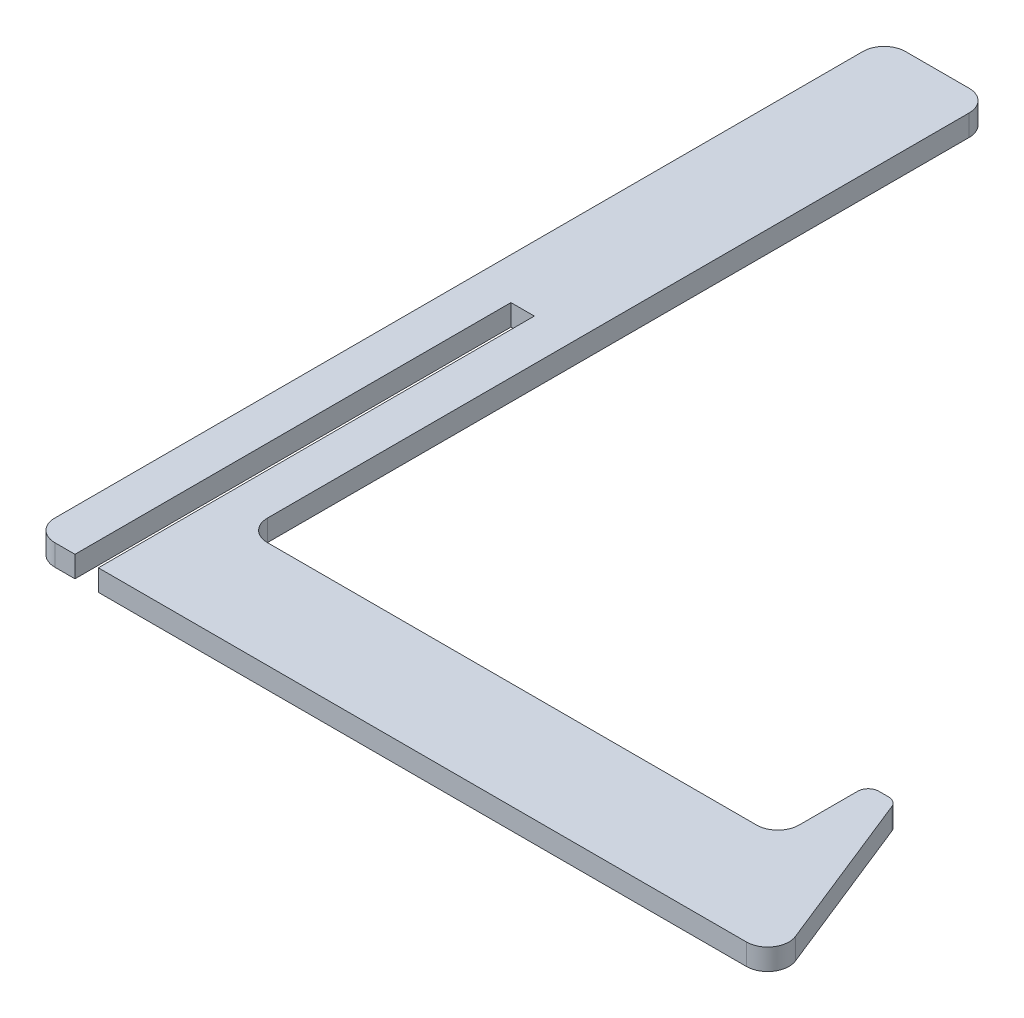
ISO-10303-21;
HEADER;
FILE_DESCRIPTION(('STEP AP214'),'2;1');
FILE_NAME('part.step','',(''),(''),'','','');
FILE_SCHEMA(('AUTOMOTIVE_DESIGN { 1 0 10303 214 1 1 1 1 }'));
ENDSEC;
DATA;
#1=APPLICATION_CONTEXT('core data for automotive mechanical design processes');
#2=APPLICATION_PROTOCOL_DEFINITION('international standard','automotive_design',2000,#1);
#3=PRODUCT_CONTEXT('',#1,'mechanical');
#4=PRODUCT('Part','Part','',(#3));
#5=PRODUCT_RELATED_PRODUCT_CATEGORY('part','',(#4));
#6=PRODUCT_DEFINITION_FORMATION('','',#4);
#7=PRODUCT_DEFINITION_CONTEXT('part definition',#1,'design');
#8=PRODUCT_DEFINITION('design','',#6,#7);
#9=PRODUCT_DEFINITION_SHAPE('','',#8);
#10=(LENGTH_UNIT() NAMED_UNIT(*) SI_UNIT(.MILLI.,.METRE.));
#11=(NAMED_UNIT(*) PLANE_ANGLE_UNIT() SI_UNIT($,.RADIAN.));
#12=(NAMED_UNIT(*) SI_UNIT($,.STERADIAN.) SOLID_ANGLE_UNIT());
#13=UNCERTAINTY_MEASURE_WITH_UNIT(LENGTH_MEASURE(1.E-05),#10,'distance_accuracy_value','');
#14=(GEOMETRIC_REPRESENTATION_CONTEXT(3) GLOBAL_UNCERTAINTY_ASSIGNED_CONTEXT((#13)) GLOBAL_UNIT_ASSIGNED_CONTEXT((#10,
#11,#12)) REPRESENTATION_CONTEXT('',''));
#15=CARTESIAN_POINT('',(0.,0.,0.));
#16=DIRECTION('',(0.,0.,1.));
#17=DIRECTION('',(1.,0.,0.));
#18=AXIS2_PLACEMENT_3D('',#15,#16,#17);
#19=CARTESIAN_POINT('',(70.,2.,0.));
#20=DIRECTION('',(0.,0.,-1.));
#21=DIRECTION('',(-1.,0.,0.));
#22=AXIS2_PLACEMENT_3D('',#19,#20,#21);
#23=PLANE('',#22);
#24=DIRECTION('',(1.,0.,0.));
#25=VECTOR('',#24,1.);
#26=CARTESIAN_POINT('',(70.,0.,0.));
#27=LINE('',#26,#25);
#28=CARTESIAN_POINT('',(2.,0.,0.));
#29=VERTEX_POINT('',#28);
#30=CARTESIAN_POINT('',(3.9,0.,0.));
#31=VERTEX_POINT('',#30);
#32=EDGE_CURVE('E192',#29,#31,#27,.T.);
#33=ORIENTED_EDGE('',*,*,#32,.T.);
#34=DIRECTION('',(0.,1.,0.));
#35=VECTOR('',#34,1.);
#36=CARTESIAN_POINT('',(3.9,0.,0.));
#37=LINE('',#36,#35);
#38=CARTESIAN_POINT('',(3.9,2.,0.));
#39=VERTEX_POINT('',#38);
#40=EDGE_CURVE('E176',#31,#39,#37,.T.);
#41=ORIENTED_EDGE('',*,*,#40,.T.);
#42=DIRECTION('',(1.,0.,0.));
#43=VECTOR('',#42,1.);
#44=CARTESIAN_POINT('',(70.,2.,0.));
#45=LINE('',#44,#43);
#46=CARTESIAN_POINT('',(2.,2.,0.));
#47=VERTEX_POINT('',#46);
#48=EDGE_CURVE('E365',#47,#39,#45,.T.);
#49=ORIENTED_EDGE('',*,*,#48,.F.);
#50=DIRECTION('',(0.,-1.,0.));
#51=VECTOR('',#50,1.);
#52=CARTESIAN_POINT('',(2.,2.,0.));
#53=LINE('',#52,#51);
#54=EDGE_CURVE('E200',#47,#29,#53,.T.);
#55=ORIENTED_EDGE('',*,*,#54,.T.);
#56=EDGE_LOOP('',(#33,#41,#49,#55));
#57=FACE_BOUND('',#56,.T.);
#58=ADVANCED_FACE('F39',(#57),#23,.F.);
#59=CARTESIAN_POINT('',(6.10000000000001,2.,0.));
#60=VERTEX_POINT('',#59);
#61=CARTESIAN_POINT('',(67.0459340771462,2.,0.));
#62=VERTEX_POINT('',#61);
#63=EDGE_CURVE('E233',#60,#62,#45,.T.);
#64=ORIENTED_EDGE('',*,*,#63,.F.);
#65=DIRECTION('',(0.,1.,0.));
#66=VECTOR('',#65,1.);
#67=CARTESIAN_POINT('',(6.10000000000001,0.,0.));
#68=LINE('',#67,#66);
#69=CARTESIAN_POINT('',(6.10000000000001,0.,0.));
#70=VERTEX_POINT('',#69);
#71=EDGE_CURVE('E187',#70,#60,#68,.T.);
#72=ORIENTED_EDGE('',*,*,#71,.F.);
#73=CARTESIAN_POINT('',(67.0459340771462,0.,0.));
#74=VERTEX_POINT('',#73);
#75=EDGE_CURVE('E203',#70,#74,#27,.T.);
#76=ORIENTED_EDGE('',*,*,#75,.T.);
#77=DIRECTION('',(0.,-1.,0.));
#78=VECTOR('',#77,1.);
#79=CARTESIAN_POINT('',(67.0459340771462,2.,0.));
#80=LINE('',#79,#78);
#81=EDGE_CURVE('E234',#74,#62,#80,.F.);
#82=ORIENTED_EDGE('',*,*,#81,.T.);
#83=EDGE_LOOP('',(#64,#72,#76,#82));
#84=FACE_BOUND('',#83,.T.);
#85=ADVANCED_FACE('F435',(#84),#23,.F.);
#86=CARTESIAN_POINT('',(60.,2.,-25.));
#87=DIRECTION('',(-0.928476690885259,0.,0.371390676354104));
#88=DIRECTION('',(0.371390676354104,0.,0.928476690885259));
#89=AXIS2_PLACEMENT_3D('',#86,#87,#88);
#90=PLANE('',#89);
#91=DIRECTION('',(-0.371390676354104,0.,-0.928476690885259));
#92=VECTOR('',#91,1.);
#93=CARTESIAN_POINT('',(60.,0.,-25.));
#94=LINE('',#93,#92);
#95=CARTESIAN_POINT('',(68.9028874589167,0.,-2.74278135270821));
#96=VERTEX_POINT('',#95);
#97=CARTESIAN_POINT('',(62.8514437294584,0.,-17.8713906763541));
#98=VERTEX_POINT('',#97);
#99=EDGE_CURVE('E202',#96,#98,#94,.T.);
#100=ORIENTED_EDGE('',*,*,#99,.T.);
#101=DIRECTION('',(0.,1.,0.));
#102=VECTOR('',#101,1.);
#103=CARTESIAN_POINT('',(62.8514437294584,2.,-17.8713906763541));
#104=LINE('',#103,#102);
#105=CARTESIAN_POINT('',(62.8514437294584,2.,-17.8713906763541));
#106=VERTEX_POINT('',#105);
#107=EDGE_CURVE('E314',#98,#106,#104,.T.);
#108=ORIENTED_EDGE('',*,*,#107,.T.);
#109=DIRECTION('',(-0.371390676354104,0.,-0.928476690885259));
#110=VECTOR('',#109,1.);
#111=CARTESIAN_POINT('',(60.,2.,-25.));
#112=LINE('',#111,#110);
#113=CARTESIAN_POINT('',(68.9028874589167,2.,-2.74278135270821));
#114=VERTEX_POINT('',#113);
#115=EDGE_CURVE('E352',#114,#106,#112,.T.);
#116=ORIENTED_EDGE('',*,*,#115,.F.);
#117=DIRECTION('',(0.,-1.,0.));
#118=VECTOR('',#117,1.);
#119=CARTESIAN_POINT('',(68.9028874589167,2.,-2.74278135270821));
#120=LINE('',#119,#118);
#121=EDGE_CURVE('E272',#114,#96,#120,.T.);
#122=ORIENTED_EDGE('',*,*,#121,.T.);
#123=EDGE_LOOP('',(#100,#108,#116,#122));
#124=FACE_BOUND('',#123,.T.);
#125=ADVANCED_FACE('F342',(#124),#90,.F.);
#126=CARTESIAN_POINT('',(60.,2.,-9.99999999999999));
#127=DIRECTION('',(1.,0.,0.));
#128=DIRECTION('',(0.,0.,-1.));
#129=AXIS2_PLACEMENT_3D('',#126,#127,#128);
#130=PLANE('',#129);
#131=DIRECTION('',(0.,0.,1.));
#132=VECTOR('',#131,1.);
#133=CARTESIAN_POINT('',(60.,2.,-9.99999999999999));
#134=LINE('',#133,#132);
#135=CARTESIAN_POINT('',(60.,2.,-17.5));
#136=VERTEX_POINT('',#135);
#137=CARTESIAN_POINT('',(60.,2.,-12.));
#138=VERTEX_POINT('',#137);
#139=EDGE_CURVE('E370',#136,#138,#134,.T.);
#140=ORIENTED_EDGE('',*,*,#139,.F.);
#141=DIRECTION('',(0.,1.,0.));
#142=VECTOR('',#141,1.);
#143=CARTESIAN_POINT('',(60.,2.,-17.5));
#144=LINE('',#143,#142);
#145=CARTESIAN_POINT('',(60.,0.,-17.5));
#146=VERTEX_POINT('',#145);
#147=EDGE_CURVE('E11',#136,#146,#144,.F.);
#148=ORIENTED_EDGE('',*,*,#147,.T.);
#149=DIRECTION('',(0.,0.,1.));
#150=VECTOR('',#149,1.);
#151=CARTESIAN_POINT('',(60.,0.,-9.99999999999999));
#152=LINE('',#151,#150);
#153=CARTESIAN_POINT('',(60.,0.,-12.));
#154=VERTEX_POINT('',#153);
#155=EDGE_CURVE('E208',#146,#154,#152,.T.);
#156=ORIENTED_EDGE('',*,*,#155,.T.);
#157=DIRECTION('',(0.,-1.,0.));
#158=VECTOR('',#157,1.);
#159=CARTESIAN_POINT('',(60.,2.,-12.));
#160=LINE('',#159,#158);
#161=EDGE_CURVE('E283',#154,#138,#160,.F.);
#162=ORIENTED_EDGE('',*,*,#161,.T.);
#163=EDGE_LOOP('',(#140,#148,#156,#162));
#164=FACE_BOUND('',#163,.T.);
#165=ADVANCED_FACE('F427',(#164),#130,.F.);
#166=CARTESIAN_POINT('',(10.,2.,-9.99999999999999));
#167=DIRECTION('',(0.,0.,1.));
#168=DIRECTION('',(1.,0.,0.));
#169=AXIS2_PLACEMENT_3D('',#166,#167,#168);
#170=PLANE('',#169);
#171=DIRECTION('',(-1.,0.,0.));
#172=VECTOR('',#171,1.);
#173=CARTESIAN_POINT('',(10.,2.,-9.99999999999999));
#174=LINE('',#173,#172);
#175=CARTESIAN_POINT('',(58.,2.,-9.99999999999999));
#176=VERTEX_POINT('',#175);
#177=CARTESIAN_POINT('',(12.,2.,-9.99999999999999));
#178=VERTEX_POINT('',#177);
#179=EDGE_CURVE('E373',#176,#178,#174,.T.);
#180=ORIENTED_EDGE('',*,*,#179,.F.);
#181=DIRECTION('',(0.,-1.,0.));
#182=VECTOR('',#181,1.);
#183=CARTESIAN_POINT('',(58.,0.,-9.99999999999999));
#184=LINE('',#183,#182);
#185=CARTESIAN_POINT('',(58.,0.,-9.99999999999999));
#186=VERTEX_POINT('',#185);
#187=EDGE_CURVE('E279',#176,#186,#184,.T.);
#188=ORIENTED_EDGE('',*,*,#187,.T.);
#189=DIRECTION('',(-1.,0.,0.));
#190=VECTOR('',#189,1.);
#191=CARTESIAN_POINT('',(10.,0.,-9.99999999999999));
#192=LINE('',#191,#190);
#193=CARTESIAN_POINT('',(12.,0.,-9.99999999999999));
#194=VERTEX_POINT('',#193);
#195=EDGE_CURVE('E217',#186,#194,#192,.T.);
#196=ORIENTED_EDGE('',*,*,#195,.T.);
#197=DIRECTION('',(0.,-1.,0.));
#198=VECTOR('',#197,1.);
#199=CARTESIAN_POINT('',(12.,2.,-9.99999999999999));
#200=LINE('',#199,#198);
#201=EDGE_CURVE('E276',#194,#178,#200,.F.);
#202=ORIENTED_EDGE('',*,*,#201,.T.);
#203=EDGE_LOOP('',(#180,#188,#196,#202));
#204=FACE_BOUND('',#203,.T.);
#205=ADVANCED_FACE('F419',(#204),#170,.F.);
#206=CARTESIAN_POINT('',(10.,2.,-80.));
#207=DIRECTION('',(-1.,0.,0.));
#208=DIRECTION('',(0.,0.,1.));
#209=AXIS2_PLACEMENT_3D('',#206,#207,#208);
#210=PLANE('',#209);
#211=DIRECTION('',(0.,0.,-1.));
#212=VECTOR('',#211,1.);
#213=CARTESIAN_POINT('',(10.,2.,-80.));
#214=LINE('',#213,#212);
#215=CARTESIAN_POINT('',(10.,2.,-12.));
#216=VERTEX_POINT('',#215);
#217=CARTESIAN_POINT('',(10.,2.,-78.));
#218=VERTEX_POINT('',#217);
#219=EDGE_CURVE('E377',#216,#218,#214,.T.);
#220=ORIENTED_EDGE('',*,*,#219,.F.);
#221=DIRECTION('',(0.,-1.,0.));
#222=VECTOR('',#221,1.);
#223=CARTESIAN_POINT('',(10.,0.,-12.));
#224=LINE('',#223,#222);
#225=CARTESIAN_POINT('',(10.,0.,-12.));
#226=VERTEX_POINT('',#225);
#227=EDGE_CURVE('E290',#216,#226,#224,.T.);
#228=ORIENTED_EDGE('',*,*,#227,.T.);
#229=DIRECTION('',(0.,0.,-1.));
#230=VECTOR('',#229,1.);
#231=CARTESIAN_POINT('',(10.,0.,-80.));
#232=LINE('',#231,#230);
#233=CARTESIAN_POINT('',(10.,0.,-78.));
#234=VERTEX_POINT('',#233);
#235=EDGE_CURVE('E221',#226,#234,#232,.T.);
#236=ORIENTED_EDGE('',*,*,#235,.T.);
#237=DIRECTION('',(0.,-1.,0.));
#238=VECTOR('',#237,1.);
#239=CARTESIAN_POINT('',(10.,2.,-78.));
#240=LINE('',#239,#238);
#241=EDGE_CURVE('E287',#234,#218,#240,.F.);
#242=ORIENTED_EDGE('',*,*,#241,.T.);
#243=EDGE_LOOP('',(#220,#228,#236,#242));
#244=FACE_BOUND('',#243,.T.);
#245=ADVANCED_FACE('F410',(#244),#210,.F.);
#246=CARTESIAN_POINT('',(0.,2.,-80.));
#247=DIRECTION('',(0.,0.,1.));
#248=DIRECTION('',(1.,0.,0.));
#249=AXIS2_PLACEMENT_3D('',#246,#247,#248);
#250=PLANE('',#249);
#251=DIRECTION('',(-1.,0.,0.));
#252=VECTOR('',#251,1.);
#253=CARTESIAN_POINT('',(0.,0.,-80.));
#254=LINE('',#253,#252);
#255=CARTESIAN_POINT('',(8.,0.,-80.));
#256=VERTEX_POINT('',#255);
#257=CARTESIAN_POINT('',(2.,0.,-80.));
#258=VERTEX_POINT('',#257);
#259=EDGE_CURVE('E225',#256,#258,#254,.T.);
#260=ORIENTED_EDGE('',*,*,#259,.T.);
#261=DIRECTION('',(0.,-1.,0.));
#262=VECTOR('',#261,1.);
#263=CARTESIAN_POINT('',(2.,2.,-80.));
#264=LINE('',#263,#262);
#265=CARTESIAN_POINT('',(2.,2.,-80.));
#266=VERTEX_POINT('',#265);
#267=EDGE_CURVE('E298',#258,#266,#264,.F.);
#268=ORIENTED_EDGE('',*,*,#267,.T.);
#269=DIRECTION('',(-1.,0.,0.));
#270=VECTOR('',#269,1.);
#271=CARTESIAN_POINT('',(0.,2.,-80.));
#272=LINE('',#271,#270);
#273=CARTESIAN_POINT('',(8.,2.,-80.));
#274=VERTEX_POINT('',#273);
#275=EDGE_CURVE('E380',#274,#266,#272,.T.);
#276=ORIENTED_EDGE('',*,*,#275,.F.);
#277=DIRECTION('',(0.,-1.,0.));
#278=VECTOR('',#277,1.);
#279=CARTESIAN_POINT('',(8.,2.,-80.));
#280=LINE('',#279,#278);
#281=EDGE_CURVE('E294',#274,#256,#280,.T.);
#282=ORIENTED_EDGE('',*,*,#281,.T.);
#283=EDGE_LOOP('',(#260,#268,#276,#282));
#284=FACE_BOUND('',#283,.T.);
#285=ADVANCED_FACE('F401',(#284),#250,.F.);
#286=CARTESIAN_POINT('',(0.,2.,0.));
#287=DIRECTION('',(1.,0.,0.));
#288=DIRECTION('',(0.,0.,-1.));
#289=AXIS2_PLACEMENT_3D('',#286,#287,#288);
#290=PLANE('',#289);
#291=DIRECTION('',(0.,0.,1.));
#292=VECTOR('',#291,1.);
#293=CARTESIAN_POINT('',(0.,0.,0.));
#294=LINE('',#293,#292);
#295=CARTESIAN_POINT('',(0.,0.,-78.));
#296=VERTEX_POINT('',#295);
#297=CARTESIAN_POINT('',(0.,0.,-2.));
#298=VERTEX_POINT('',#297);
#299=EDGE_CURVE('E229',#296,#298,#294,.T.);
#300=ORIENTED_EDGE('',*,*,#299,.T.);
#301=DIRECTION('',(0.,-1.,0.));
#302=VECTOR('',#301,1.);
#303=CARTESIAN_POINT('',(0.,2.,-2.));
#304=LINE('',#303,#302);
#305=CARTESIAN_POINT('',(0.,2.,-2.));
#306=VERTEX_POINT('',#305);
#307=EDGE_CURVE('E257',#298,#306,#304,.F.);
#308=ORIENTED_EDGE('',*,*,#307,.T.);
#309=DIRECTION('',(0.,0.,1.));
#310=VECTOR('',#309,1.);
#311=CARTESIAN_POINT('',(0.,2.,0.));
#312=LINE('',#311,#310);
#313=CARTESIAN_POINT('',(0.,2.,-78.));
#314=VERTEX_POINT('',#313);
#315=EDGE_CURVE('E212',#314,#306,#312,.T.);
#316=ORIENTED_EDGE('',*,*,#315,.F.);
#317=DIRECTION('',(0.,-1.,0.));
#318=VECTOR('',#317,1.);
#319=CARTESIAN_POINT('',(0.,2.,-78.));
#320=LINE('',#319,#318);
#321=EDGE_CURVE('E253',#314,#296,#320,.T.);
#322=ORIENTED_EDGE('',*,*,#321,.T.);
#323=EDGE_LOOP('',(#300,#308,#316,#322));
#324=FACE_BOUND('',#323,.T.);
#325=ADVANCED_FACE('F395',(#324),#290,.F.);
#326=CARTESIAN_POINT('',(0.,2.,0.));
#327=DIRECTION('',(0.,-1.,0.));
#328=DIRECTION('',(0.,0.,-1.));
#329=AXIS2_PLACEMENT_3D('',#326,#327,#328);
#330=PLANE('',#329);
#331=ORIENTED_EDGE('',*,*,#48,.T.);
#332=DIRECTION('',(0.,0.,1.));
#333=VECTOR('',#332,1.);
#334=CARTESIAN_POINT('',(3.9,2.,0.));
#335=LINE('',#334,#333);
#336=CARTESIAN_POINT('',(3.9,2.,-41.));
#337=VERTEX_POINT('',#336);
#338=EDGE_CURVE('E181',#337,#39,#335,.T.);
#339=ORIENTED_EDGE('',*,*,#338,.F.);
#340=DIRECTION('',(-1.,0.,0.));
#341=VECTOR('',#340,1.);
#342=CARTESIAN_POINT('',(3.9,2.,-41.));
#343=LINE('',#342,#341);
#344=CARTESIAN_POINT('',(6.10000000000001,2.,-41.));
#345=VERTEX_POINT('',#344);
#346=EDGE_CURVE('E196',#345,#337,#343,.T.);
#347=ORIENTED_EDGE('',*,*,#346,.F.);
#348=DIRECTION('',(0.,0.,-1.));
#349=VECTOR('',#348,1.);
#350=CARTESIAN_POINT('',(6.10000000000001,2.,0.));
#351=LINE('',#350,#349);
#352=EDGE_CURVE('E587',#60,#345,#351,.T.);
#353=ORIENTED_EDGE('',*,*,#352,.F.);
#354=ORIENTED_EDGE('',*,*,#63,.T.);
#355=CARTESIAN_POINT('',(67.0459340771462,2.,-2.));
#356=DIRECTION('',(0.,-1.,0.));
#357=DIRECTION('',(0.,0.,-1.));
#358=AXIS2_PLACEMENT_3D('',#355,#356,#357);
#359=CIRCLE('',#358,2.);
#360=EDGE_CURVE('E266',#62,#114,#359,.F.);
#361=ORIENTED_EDGE('',*,*,#360,.T.);
#362=ORIENTED_EDGE('',*,*,#115,.T.);
#363=CARTESIAN_POINT('',(61.9229670385731,2.,-17.5));
#364=DIRECTION('',(0.,-1.,0.));
#365=DIRECTION('',(0.,0.,-1.));
#366=AXIS2_PLACEMENT_3D('',#363,#364,#365);
#367=CIRCLE('',#366,1.);
#368=CARTESIAN_POINT('',(61.9229670385731,2.,-18.5));
#369=VERTEX_POINT('',#368);
#370=EDGE_CURVE('E321',#106,#369,#367,.F.);
#371=ORIENTED_EDGE('',*,*,#370,.T.);
#372=DIRECTION('',(1.,0.,0.));
#373=VECTOR('',#372,1.);
#374=CARTESIAN_POINT('',(60.,2.,-18.5));
#375=LINE('',#374,#373);
#376=CARTESIAN_POINT('',(61.,2.,-18.5));
#377=VERTEX_POINT('',#376);
#378=EDGE_CURVE('E351',#377,#369,#375,.T.);
#379=ORIENTED_EDGE('',*,*,#378,.F.);
#380=CARTESIAN_POINT('',(61.,2.,-17.5));
#381=DIRECTION('',(0.,-1.,0.));
#382=DIRECTION('',(0.,0.,-1.));
#383=AXIS2_PLACEMENT_3D('',#380,#381,#382);
#384=CIRCLE('',#383,1.);
#385=EDGE_CURVE('E318',#377,#136,#384,.F.);
#386=ORIENTED_EDGE('',*,*,#385,.T.);
#387=ORIENTED_EDGE('',*,*,#139,.T.);
#388=CARTESIAN_POINT('',(58.,2.,-12.));
#389=DIRECTION('',(0.,-1.,0.));
#390=DIRECTION('',(0.,0.,-1.));
#391=AXIS2_PLACEMENT_3D('',#388,#389,#390);
#392=CIRCLE('',#391,2.);
#393=EDGE_CURVE('E305',#138,#176,#392,.T.);
#394=ORIENTED_EDGE('',*,*,#393,.T.);
#395=ORIENTED_EDGE('',*,*,#179,.T.);
#396=CARTESIAN_POINT('',(12.,2.,-12.));
#397=DIRECTION('',(0.,-1.,0.));
#398=DIRECTION('',(0.,0.,-1.));
#399=AXIS2_PLACEMENT_3D('',#396,#397,#398);
#400=CIRCLE('',#399,2.);
#401=EDGE_CURVE('E311',#178,#216,#400,.T.);
#402=ORIENTED_EDGE('',*,*,#401,.T.);
#403=ORIENTED_EDGE('',*,*,#219,.T.);
#404=CARTESIAN_POINT('',(8.,2.,-78.));
#405=DIRECTION('',(0.,-1.,0.));
#406=DIRECTION('',(0.,0.,-1.));
#407=AXIS2_PLACEMENT_3D('',#404,#405,#406);
#408=CIRCLE('',#407,2.);
#409=EDGE_CURVE('E260',#218,#274,#408,.F.);
#410=ORIENTED_EDGE('',*,*,#409,.T.);
#411=ORIENTED_EDGE('',*,*,#275,.T.);
#412=CARTESIAN_POINT('',(2.,2.,-78.));
#413=DIRECTION('',(0.,-1.,0.));
#414=DIRECTION('',(0.,0.,-1.));
#415=AXIS2_PLACEMENT_3D('',#412,#413,#414);
#416=CIRCLE('',#415,2.);
#417=EDGE_CURVE('E263',#266,#314,#416,.F.);
#418=ORIENTED_EDGE('',*,*,#417,.T.);
#419=ORIENTED_EDGE('',*,*,#315,.T.);
#420=CARTESIAN_POINT('',(2.,2.,-2.));
#421=DIRECTION('',(0.,-1.,0.));
#422=DIRECTION('',(0.,0.,-1.));
#423=AXIS2_PLACEMENT_3D('',#420,#421,#422);
#424=CIRCLE('',#423,2.);
#425=EDGE_CURVE('E269',#306,#47,#424,.F.);
#426=ORIENTED_EDGE('',*,*,#425,.T.);
#427=EDGE_LOOP('',(#331,#339,#347,#353,#354,#361,#362,#371,#379,#386,#387,#394,#395,#402,#403,
#410,#411,#418,#419,#426));
#428=FACE_BOUND('',#427,.T.);
#429=ADVANCED_FACE('F350',(#428),#330,.F.);
#430=CARTESIAN_POINT('',(0.,0.,0.));
#431=DIRECTION('',(0.,-1.,0.));
#432=DIRECTION('',(0.,0.,-1.));
#433=AXIS2_PLACEMENT_3D('',#430,#431,#432);
#434=PLANE('',#433);
#435=DIRECTION('',(0.,0.,1.));
#436=VECTOR('',#435,1.);
#437=CARTESIAN_POINT('',(3.9,0.,0.));
#438=LINE('',#437,#436);
#439=CARTESIAN_POINT('',(3.9,0.,-41.));
#440=VERTEX_POINT('',#439);
#441=EDGE_CURVE('E179',#440,#31,#438,.T.);
#442=ORIENTED_EDGE('',*,*,#441,.T.);
#443=ORIENTED_EDGE('',*,*,#32,.F.);
#444=CARTESIAN_POINT('',(2.,0.,-2.));
#445=DIRECTION('',(0.,-1.,0.));
#446=DIRECTION('',(0.,0.,-1.));
#447=AXIS2_PLACEMENT_3D('',#444,#445,#446);
#448=CIRCLE('',#447,2.);
#449=EDGE_CURVE('E250',#29,#298,#448,.T.);
#450=ORIENTED_EDGE('',*,*,#449,.T.);
#451=ORIENTED_EDGE('',*,*,#299,.F.);
#452=CARTESIAN_POINT('',(2.,0.,-78.));
#453=DIRECTION('',(0.,-1.,0.));
#454=DIRECTION('',(0.,0.,-1.));
#455=AXIS2_PLACEMENT_3D('',#452,#453,#454);
#456=CIRCLE('',#455,2.);
#457=EDGE_CURVE('E243',#296,#258,#456,.T.);
#458=ORIENTED_EDGE('',*,*,#457,.T.);
#459=ORIENTED_EDGE('',*,*,#259,.F.);
#460=CARTESIAN_POINT('',(8.,0.,-78.));
#461=DIRECTION('',(0.,-1.,0.));
#462=DIRECTION('',(0.,0.,-1.));
#463=AXIS2_PLACEMENT_3D('',#460,#461,#462);
#464=CIRCLE('',#463,2.);
#465=EDGE_CURVE('E240',#256,#234,#464,.T.);
#466=ORIENTED_EDGE('',*,*,#465,.T.);
#467=ORIENTED_EDGE('',*,*,#235,.F.);
#468=CARTESIAN_POINT('',(12.,0.,-12.));
#469=DIRECTION('',(0.,-1.,0.));
#470=DIRECTION('',(0.,0.,-1.));
#471=AXIS2_PLACEMENT_3D('',#468,#469,#470);
#472=CIRCLE('',#471,2.);
#473=EDGE_CURVE('E308',#226,#194,#472,.F.);
#474=ORIENTED_EDGE('',*,*,#473,.T.);
#475=ORIENTED_EDGE('',*,*,#195,.F.);
#476=CARTESIAN_POINT('',(58.,0.,-12.));
#477=DIRECTION('',(0.,-1.,0.));
#478=DIRECTION('',(0.,0.,-1.));
#479=AXIS2_PLACEMENT_3D('',#476,#477,#478);
#480=CIRCLE('',#479,2.);
#481=EDGE_CURVE('E301',#186,#154,#480,.F.);
#482=ORIENTED_EDGE('',*,*,#481,.T.);
#483=ORIENTED_EDGE('',*,*,#155,.F.);
#484=CARTESIAN_POINT('',(61.,0.,-17.5));
#485=DIRECTION('',(0.,-1.,0.));
#486=DIRECTION('',(0.,0.,-1.));
#487=AXIS2_PLACEMENT_3D('',#484,#485,#486);
#488=CIRCLE('',#487,1.);
#489=CARTESIAN_POINT('',(61.,0.,-18.5));
#490=VERTEX_POINT('',#489);
#491=EDGE_CURVE('E331',#146,#490,#488,.T.);
#492=ORIENTED_EDGE('',*,*,#491,.T.);
#493=DIRECTION('',(1.,0.,0.));
#494=VECTOR('',#493,1.);
#495=CARTESIAN_POINT('',(60.,0.,-18.5));
#496=LINE('',#495,#494);
#497=CARTESIAN_POINT('',(61.9229670385731,0.,-18.5));
#498=VERTEX_POINT('',#497);
#499=EDGE_CURVE('E210',#490,#498,#496,.T.);
#500=ORIENTED_EDGE('',*,*,#499,.T.);
#501=CARTESIAN_POINT('',(61.9229670385731,0.,-17.5));
#502=DIRECTION('',(0.,-1.,0.));
#503=DIRECTION('',(0.,0.,-1.));
#504=AXIS2_PLACEMENT_3D('',#501,#502,#503);
#505=CIRCLE('',#504,1.);
#506=EDGE_CURVE('E48',#498,#98,#505,.T.);
#507=ORIENTED_EDGE('',*,*,#506,.T.);
#508=ORIENTED_EDGE('',*,*,#99,.F.);
#509=CARTESIAN_POINT('',(67.0459340771462,0.,-2.));
#510=DIRECTION('',(0.,-1.,0.));
#511=DIRECTION('',(0.,0.,-1.));
#512=AXIS2_PLACEMENT_3D('',#509,#510,#511);
#513=CIRCLE('',#512,2.);
#514=EDGE_CURVE('E246',#96,#74,#513,.T.);
#515=ORIENTED_EDGE('',*,*,#514,.T.);
#516=ORIENTED_EDGE('',*,*,#75,.F.);
#517=DIRECTION('',(0.,0.,-1.));
#518=VECTOR('',#517,1.);
#519=CARTESIAN_POINT('',(6.10000000000001,0.,0.));
#520=LINE('',#519,#518);
#521=CARTESIAN_POINT('',(6.10000000000001,0.,-41.));
#522=VERTEX_POINT('',#521);
#523=EDGE_CURVE('E195',#70,#522,#520,.T.);
#524=ORIENTED_EDGE('',*,*,#523,.T.);
#525=DIRECTION('',(-1.,0.,0.));
#526=VECTOR('',#525,1.);
#527=CARTESIAN_POINT('',(3.9,0.,-41.));
#528=LINE('',#527,#526);
#529=EDGE_CURVE('E55',#522,#440,#528,.T.);
#530=ORIENTED_EDGE('',*,*,#529,.T.);
#531=EDGE_LOOP('',(#442,#443,#450,#451,#458,#459,#466,#467,#474,#475,#482,#483,#492,#500,#507,
#508,#515,#516,#524,#530));
#532=FACE_BOUND('',#531,.T.);
#533=ADVANCED_FACE('F191',(#532),#434,.T.);
#534=CARTESIAN_POINT('',(2.,2.,-2.));
#535=DIRECTION('',(0.,-1.,0.));
#536=DIRECTION('',(0.,0.,-1.));
#537=AXIS2_PLACEMENT_3D('',#534,#535,#536);
#538=CYLINDRICAL_SURFACE('',#537,2.);
#539=ORIENTED_EDGE('',*,*,#425,.F.);
#540=ORIENTED_EDGE('',*,*,#307,.F.);
#541=ORIENTED_EDGE('',*,*,#449,.F.);
#542=ORIENTED_EDGE('',*,*,#54,.F.);
#543=EDGE_LOOP('',(#539,#540,#541,#542));
#544=FACE_BOUND('',#543,.T.);
#545=ADVANCED_FACE('F393',(#544),#538,.T.);
#546=CARTESIAN_POINT('',(67.0459340771462,2.,-2.));
#547=DIRECTION('',(0.,-1.,0.));
#548=DIRECTION('',(0.,0.,-1.));
#549=AXIS2_PLACEMENT_3D('',#546,#547,#548);
#550=CYLINDRICAL_SURFACE('',#549,2.);
#551=ORIENTED_EDGE('',*,*,#360,.F.);
#552=ORIENTED_EDGE('',*,*,#81,.F.);
#553=ORIENTED_EDGE('',*,*,#514,.F.);
#554=ORIENTED_EDGE('',*,*,#121,.F.);
#555=EDGE_LOOP('',(#551,#552,#553,#554));
#556=FACE_BOUND('',#555,.T.);
#557=ADVANCED_FACE('F446',(#556),#550,.T.);
#558=CARTESIAN_POINT('',(58.,2.,-12.));
#559=DIRECTION('',(0.,1.,0.));
#560=DIRECTION('',(0.,0.,1.));
#561=AXIS2_PLACEMENT_3D('',#558,#559,#560);
#562=CYLINDRICAL_SURFACE('',#561,2.);
#563=ORIENTED_EDGE('',*,*,#393,.F.);
#564=ORIENTED_EDGE('',*,*,#161,.F.);
#565=ORIENTED_EDGE('',*,*,#481,.F.);
#566=ORIENTED_EDGE('',*,*,#187,.F.);
#567=EDGE_LOOP('',(#563,#564,#565,#566));
#568=FACE_BOUND('',#567,.T.);
#569=ADVANCED_FACE('F423',(#568),#562,.F.);
#570=CARTESIAN_POINT('',(12.,2.,-12.));
#571=DIRECTION('',(0.,1.,0.));
#572=DIRECTION('',(0.,0.,1.));
#573=AXIS2_PLACEMENT_3D('',#570,#571,#572);
#574=CYLINDRICAL_SURFACE('',#573,2.);
#575=ORIENTED_EDGE('',*,*,#401,.F.);
#576=ORIENTED_EDGE('',*,*,#201,.F.);
#577=ORIENTED_EDGE('',*,*,#473,.F.);
#578=ORIENTED_EDGE('',*,*,#227,.F.);
#579=EDGE_LOOP('',(#575,#576,#577,#578));
#580=FACE_BOUND('',#579,.T.);
#581=ADVANCED_FACE('F414',(#580),#574,.F.);
#582=CARTESIAN_POINT('',(2.,2.,-78.));
#583=DIRECTION('',(0.,-1.,0.));
#584=DIRECTION('',(0.,0.,-1.));
#585=AXIS2_PLACEMENT_3D('',#582,#583,#584);
#586=CYLINDRICAL_SURFACE('',#585,2.);
#587=ORIENTED_EDGE('',*,*,#417,.F.);
#588=ORIENTED_EDGE('',*,*,#267,.F.);
#589=ORIENTED_EDGE('',*,*,#457,.F.);
#590=ORIENTED_EDGE('',*,*,#321,.F.);
#591=EDGE_LOOP('',(#587,#588,#589,#590));
#592=FACE_BOUND('',#591,.T.);
#593=ADVANCED_FACE('F397',(#592),#586,.T.);
#594=CARTESIAN_POINT('',(8.,2.,-78.));
#595=DIRECTION('',(0.,-1.,0.));
#596=DIRECTION('',(0.,0.,-1.));
#597=AXIS2_PLACEMENT_3D('',#594,#595,#596);
#598=CYLINDRICAL_SURFACE('',#597,2.);
#599=ORIENTED_EDGE('',*,*,#409,.F.);
#600=ORIENTED_EDGE('',*,*,#241,.F.);
#601=ORIENTED_EDGE('',*,*,#465,.F.);
#602=ORIENTED_EDGE('',*,*,#281,.F.);
#603=EDGE_LOOP('',(#599,#600,#601,#602));
#604=FACE_BOUND('',#603,.T.);
#605=ADVANCED_FACE('F405',(#604),#598,.T.);
#606=CARTESIAN_POINT('',(60.,0.,-18.5));
#607=DIRECTION('',(0.,0.,1.));
#608=DIRECTION('',(1.,0.,0.));
#609=AXIS2_PLACEMENT_3D('',#606,#607,#608);
#610=PLANE('',#609);
#611=ORIENTED_EDGE('',*,*,#378,.T.);
#612=DIRECTION('',(0.,1.,0.));
#613=VECTOR('',#612,1.);
#614=CARTESIAN_POINT('',(61.9229670385731,0.,-18.5));
#615=LINE('',#614,#613);
#616=EDGE_CURVE('E328',#369,#498,#615,.F.);
#617=ORIENTED_EDGE('',*,*,#616,.T.);
#618=ORIENTED_EDGE('',*,*,#499,.F.);
#619=DIRECTION('',(0.,1.,0.));
#620=VECTOR('',#619,1.);
#621=CARTESIAN_POINT('',(61.,0.,-18.5));
#622=LINE('',#621,#620);
#623=EDGE_CURVE('E324',#490,#377,#622,.T.);
#624=ORIENTED_EDGE('',*,*,#623,.T.);
#625=EDGE_LOOP('',(#611,#617,#618,#624));
#626=FACE_BOUND('',#625,.T.);
#627=ADVANCED_FACE('F354',(#626),#610,.F.);
#628=CARTESIAN_POINT('',(61.9229670385731,2.,-17.5));
#629=DIRECTION('',(0.,1.,0.));
#630=DIRECTION('',(0.,0.,1.));
#631=AXIS2_PLACEMENT_3D('',#628,#629,#630);
#632=CYLINDRICAL_SURFACE('',#631,1.);
#633=ORIENTED_EDGE('',*,*,#506,.F.);
#634=ORIENTED_EDGE('',*,*,#616,.F.);
#635=ORIENTED_EDGE('',*,*,#370,.F.);
#636=ORIENTED_EDGE('',*,*,#107,.F.);
#637=EDGE_LOOP('',(#633,#634,#635,#636));
#638=FACE_BOUND('',#637,.T.);
#639=ADVANCED_FACE('F346',(#638),#632,.T.);
#640=CARTESIAN_POINT('',(61.,0.,-17.5));
#641=DIRECTION('',(0.,1.,0.));
#642=DIRECTION('',(0.,0.,1.));
#643=AXIS2_PLACEMENT_3D('',#640,#641,#642);
#644=CYLINDRICAL_SURFACE('',#643,1.);
#645=ORIENTED_EDGE('',*,*,#491,.F.);
#646=ORIENTED_EDGE('',*,*,#147,.F.);
#647=ORIENTED_EDGE('',*,*,#385,.F.);
#648=ORIENTED_EDGE('',*,*,#623,.F.);
#649=EDGE_LOOP('',(#645,#646,#647,#648));
#650=FACE_BOUND('',#649,.T.);
#651=ADVANCED_FACE('F41',(#650),#644,.T.);
#652=CARTESIAN_POINT('',(3.9,0.,0.));
#653=DIRECTION('',(-1.,0.,0.));
#654=DIRECTION('',(0.,0.,1.));
#655=AXIS2_PLACEMENT_3D('',#652,#653,#654);
#656=PLANE('',#655);
#657=ORIENTED_EDGE('',*,*,#338,.T.);
#658=ORIENTED_EDGE('',*,*,#40,.F.);
#659=ORIENTED_EDGE('',*,*,#441,.F.);
#660=DIRECTION('',(0.,1.,0.));
#661=VECTOR('',#660,1.);
#662=CARTESIAN_POINT('',(3.9,0.,-41.));
#663=LINE('',#662,#661);
#664=EDGE_CURVE('E357',#440,#337,#663,.T.);
#665=ORIENTED_EDGE('',*,*,#664,.T.);
#666=EDGE_LOOP('',(#657,#658,#659,#665));
#667=FACE_BOUND('',#666,.T.);
#668=ADVANCED_FACE('F178',(#667),#656,.F.);
#669=CARTESIAN_POINT('',(3.9,0.,-41.));
#670=DIRECTION('',(0.,0.,-1.));
#671=DIRECTION('',(-1.,0.,0.));
#672=AXIS2_PLACEMENT_3D('',#669,#670,#671);
#673=PLANE('',#672);
#674=ORIENTED_EDGE('',*,*,#346,.T.);
#675=ORIENTED_EDGE('',*,*,#664,.F.);
#676=ORIENTED_EDGE('',*,*,#529,.F.);
#677=DIRECTION('',(0.,1.,0.));
#678=VECTOR('',#677,1.);
#679=CARTESIAN_POINT('',(6.10000000000001,0.,-41.));
#680=LINE('',#679,#678);
#681=EDGE_CURVE('E362',#522,#345,#680,.T.);
#682=ORIENTED_EDGE('',*,*,#681,.T.);
#683=EDGE_LOOP('',(#674,#675,#676,#682));
#684=FACE_BOUND('',#683,.T.);
#685=ADVANCED_FACE('F566',(#684),#673,.F.);
#686=CARTESIAN_POINT('',(6.10000000000001,0.,0.));
#687=DIRECTION('',(1.,0.,0.));
#688=DIRECTION('',(0.,0.,-1.));
#689=AXIS2_PLACEMENT_3D('',#686,#687,#688);
#690=PLANE('',#689);
#691=ORIENTED_EDGE('',*,*,#352,.T.);
#692=ORIENTED_EDGE('',*,*,#681,.F.);
#693=ORIENTED_EDGE('',*,*,#523,.F.);
#694=ORIENTED_EDGE('',*,*,#71,.T.);
#695=EDGE_LOOP('',(#691,#692,#693,#694));
#696=FACE_BOUND('',#695,.T.);
#697=ADVANCED_FACE('F573',(#696),#690,.F.);
#698=CLOSED_SHELL('',(#58,#85,#125,#165,#205,#245,#285,#325,#429,#533,#545,#557,#569,#581,#593,
#605,#627,#639,#651,#668,#685,#697));
#699=MANIFOLD_SOLID_BREP('B2',#698);
#700=ADVANCED_BREP_SHAPE_REPRESENTATION('',(#18,#699),#14);
#701=SHAPE_DEFINITION_REPRESENTATION(#9,#700);
ENDSEC;
END-ISO-10303-21;
